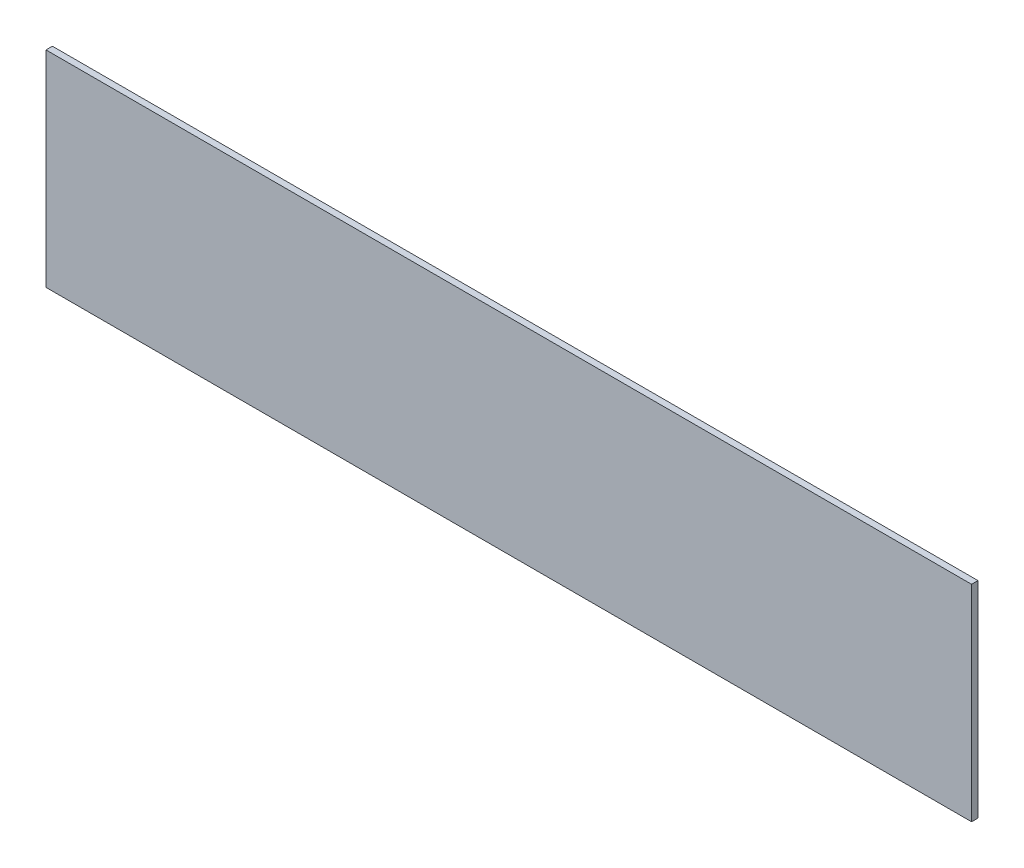
ISO-10303-21;
HEADER;
FILE_DESCRIPTION(('STEP AP214'),'2;1');
FILE_NAME('part.step','',(''),(''),'','','');
FILE_SCHEMA(('AUTOMOTIVE_DESIGN { 1 0 10303 214 1 1 1 1 }'));
ENDSEC;
DATA;
#1=APPLICATION_CONTEXT('core data for automotive mechanical design processes');
#2=APPLICATION_PROTOCOL_DEFINITION('international standard','automotive_design',2000,#1);
#3=PRODUCT_CONTEXT('',#1,'mechanical');
#4=PRODUCT('Part','Part','',(#3));
#5=PRODUCT_RELATED_PRODUCT_CATEGORY('part','',(#4));
#6=PRODUCT_DEFINITION_FORMATION('','',#4);
#7=PRODUCT_DEFINITION_CONTEXT('part definition',#1,'design');
#8=PRODUCT_DEFINITION('design','',#6,#7);
#9=PRODUCT_DEFINITION_SHAPE('','',#8);
#10=(LENGTH_UNIT() NAMED_UNIT(*) SI_UNIT(.MILLI.,.METRE.));
#11=(NAMED_UNIT(*) PLANE_ANGLE_UNIT() SI_UNIT($,.RADIAN.));
#12=(NAMED_UNIT(*) SI_UNIT($,.STERADIAN.) SOLID_ANGLE_UNIT());
#13=UNCERTAINTY_MEASURE_WITH_UNIT(LENGTH_MEASURE(1.E-05),#10,'distance_accuracy_value','');
#14=(GEOMETRIC_REPRESENTATION_CONTEXT(3) GLOBAL_UNCERTAINTY_ASSIGNED_CONTEXT((#13)) GLOBAL_UNIT_ASSIGNED_CONTEXT((#10,
#11,#12)) REPRESENTATION_CONTEXT('',''));
#15=CARTESIAN_POINT('',(0.,0.,0.));
#16=DIRECTION('',(0.,0.,1.));
#17=DIRECTION('',(1.,0.,0.));
#18=AXIS2_PLACEMENT_3D('',#15,#16,#17);
#19=CARTESIAN_POINT('',(0.,0.,1.5875));
#20=DIRECTION('',(-1.,0.,0.));
#21=DIRECTION('',(0.,0.,1.));
#22=AXIS2_PLACEMENT_3D('',#19,#20,#21);
#23=PLANE('',#22);
#24=DIRECTION('',(0.,1.,0.));
#25=VECTOR('',#24,1.);
#26=CARTESIAN_POINT('',(0.,0.,0.));
#27=LINE('',#26,#25);
#28=CARTESIAN_POINT('',(0.,-50.8,0.));
#29=VERTEX_POINT('',#28);
#30=CARTESIAN_POINT('',(0.,0.,0.));
#31=VERTEX_POINT('',#30);
#32=EDGE_CURVE('E99',#29,#31,#27,.T.);
#33=ORIENTED_EDGE('',*,*,#32,.T.);
#34=DIRECTION('',(0.,0.,-1.));
#35=VECTOR('',#34,1.);
#36=CARTESIAN_POINT('',(0.,0.,1.5875));
#37=LINE('',#36,#35);
#38=CARTESIAN_POINT('',(0.,0.,1.5875));
#39=VERTEX_POINT('',#38);
#40=EDGE_CURVE('E11',#39,#31,#37,.T.);
#41=ORIENTED_EDGE('',*,*,#40,.F.);
#42=DIRECTION('',(0.,1.,0.));
#43=VECTOR('',#42,1.);
#44=CARTESIAN_POINT('',(0.,0.,1.5875));
#45=LINE('',#44,#43);
#46=CARTESIAN_POINT('',(0.,-50.8,1.5875));
#47=VERTEX_POINT('',#46);
#48=EDGE_CURVE('E87',#47,#39,#45,.T.);
#49=ORIENTED_EDGE('',*,*,#48,.F.);
#50=DIRECTION('',(0.,0.,-1.));
#51=VECTOR('',#50,1.);
#52=CARTESIAN_POINT('',(0.,-50.8,1.5875));
#53=LINE('',#52,#51);
#54=EDGE_CURVE('E95',#47,#29,#53,.T.);
#55=ORIENTED_EDGE('',*,*,#54,.T.);
#56=EDGE_LOOP('',(#33,#41,#49,#55));
#57=FACE_BOUND('',#56,.T.);
#58=ADVANCED_FACE('F36',(#57),#23,.F.);
#59=CARTESIAN_POINT('',(0.,0.,1.5875));
#60=DIRECTION('',(0.,-1.,0.));
#61=DIRECTION('',(1.,0.,0.));
#62=AXIS2_PLACEMENT_3D('',#59,#60,#61);
#63=PLANE('',#62);
#64=DIRECTION('',(-1.,0.,0.));
#65=VECTOR('',#64,1.);
#66=CARTESIAN_POINT('',(0.,0.,0.));
#67=LINE('',#66,#65);
#68=CARTESIAN_POINT('',(-228.6,0.,0.));
#69=VERTEX_POINT('',#68);
#70=EDGE_CURVE('E91',#31,#69,#67,.T.);
#71=ORIENTED_EDGE('',*,*,#70,.T.);
#72=DIRECTION('',(0.,0.,-1.));
#73=VECTOR('',#72,1.);
#74=CARTESIAN_POINT('',(-228.6,0.,1.5875));
#75=LINE('',#74,#73);
#76=CARTESIAN_POINT('',(-228.6,0.,1.5875));
#77=VERTEX_POINT('',#76);
#78=EDGE_CURVE('E44',#77,#69,#75,.T.);
#79=ORIENTED_EDGE('',*,*,#78,.F.);
#80=DIRECTION('',(-1.,0.,0.));
#81=VECTOR('',#80,1.);
#82=CARTESIAN_POINT('',(0.,0.,1.5875));
#83=LINE('',#82,#81);
#84=EDGE_CURVE('E82',#39,#77,#83,.T.);
#85=ORIENTED_EDGE('',*,*,#84,.F.);
#86=ORIENTED_EDGE('',*,*,#40,.T.);
#87=EDGE_LOOP('',(#71,#79,#85,#86));
#88=FACE_BOUND('',#87,.T.);
#89=ADVANCED_FACE('F90',(#88),#63,.F.);
#90=CARTESIAN_POINT('',(-228.6,0.,1.5875));
#91=DIRECTION('',(1.,0.,0.));
#92=DIRECTION('',(0.,0.,-1.));
#93=AXIS2_PLACEMENT_3D('',#90,#91,#92);
#94=PLANE('',#93);
#95=DIRECTION('',(0.,-1.,0.));
#96=VECTOR('',#95,1.);
#97=CARTESIAN_POINT('',(-228.6,0.,0.));
#98=LINE('',#97,#96);
#99=CARTESIAN_POINT('',(-228.6,-50.8,0.));
#100=VERTEX_POINT('',#99);
#101=EDGE_CURVE('E69',#69,#100,#98,.T.);
#102=ORIENTED_EDGE('',*,*,#101,.T.);
#103=DIRECTION('',(0.,0.,-1.));
#104=VECTOR('',#103,1.);
#105=CARTESIAN_POINT('',(-228.6,-50.8,1.5875));
#106=LINE('',#105,#104);
#107=CARTESIAN_POINT('',(-228.6,-50.8,1.5875));
#108=VERTEX_POINT('',#107);
#109=EDGE_CURVE('E92',#108,#100,#106,.T.);
#110=ORIENTED_EDGE('',*,*,#109,.F.);
#111=DIRECTION('',(0.,-1.,0.));
#112=VECTOR('',#111,1.);
#113=CARTESIAN_POINT('',(-228.6,0.,1.5875));
#114=LINE('',#113,#112);
#115=EDGE_CURVE('E85',#77,#108,#114,.T.);
#116=ORIENTED_EDGE('',*,*,#115,.F.);
#117=ORIENTED_EDGE('',*,*,#78,.T.);
#118=EDGE_LOOP('',(#102,#110,#116,#117));
#119=FACE_BOUND('',#118,.T.);
#120=ADVANCED_FACE('F93',(#119),#94,.F.);
#121=CARTESIAN_POINT('',(0.,-50.8,1.5875));
#122=DIRECTION('',(0.,1.,0.));
#123=DIRECTION('',(-1.,0.,0.));
#124=AXIS2_PLACEMENT_3D('',#121,#122,#123);
#125=PLANE('',#124);
#126=DIRECTION('',(1.,0.,0.));
#127=VECTOR('',#126,1.);
#128=CARTESIAN_POINT('',(0.,-50.8,0.));
#129=LINE('',#128,#127);
#130=EDGE_CURVE('E75',#100,#29,#129,.T.);
#131=ORIENTED_EDGE('',*,*,#130,.T.);
#132=ORIENTED_EDGE('',*,*,#54,.F.);
#133=DIRECTION('',(1.,0.,0.));
#134=VECTOR('',#133,1.);
#135=CARTESIAN_POINT('',(0.,-50.8,1.5875));
#136=LINE('',#135,#134);
#137=EDGE_CURVE('E52',#108,#47,#136,.T.);
#138=ORIENTED_EDGE('',*,*,#137,.F.);
#139=ORIENTED_EDGE('',*,*,#109,.T.);
#140=EDGE_LOOP('',(#131,#132,#138,#139));
#141=FACE_BOUND('',#140,.T.);
#142=ADVANCED_FACE('F106',(#141),#125,.F.);
#143=CARTESIAN_POINT('',(0.,0.,1.5875));
#144=DIRECTION('',(0.,0.,-1.));
#145=DIRECTION('',(-1.,0.,0.));
#146=AXIS2_PLACEMENT_3D('',#143,#144,#145);
#147=PLANE('',#146);
#148=ORIENTED_EDGE('',*,*,#48,.T.);
#149=ORIENTED_EDGE('',*,*,#84,.T.);
#150=ORIENTED_EDGE('',*,*,#115,.T.);
#151=ORIENTED_EDGE('',*,*,#137,.T.);
#152=EDGE_LOOP('',(#148,#149,#150,#151));
#153=FACE_BOUND('',#152,.T.);
#154=ADVANCED_FACE('F83',(#153),#147,.F.);
#155=CARTESIAN_POINT('',(0.,0.,0.));
#156=DIRECTION('',(0.,0.,-1.));
#157=DIRECTION('',(-1.,0.,0.));
#158=AXIS2_PLACEMENT_3D('',#155,#156,#157);
#159=PLANE('',#158);
#160=ORIENTED_EDGE('',*,*,#32,.F.);
#161=ORIENTED_EDGE('',*,*,#130,.F.);
#162=ORIENTED_EDGE('',*,*,#101,.F.);
#163=ORIENTED_EDGE('',*,*,#70,.F.);
#164=EDGE_LOOP('',(#160,#161,#162,#163));
#165=FACE_BOUND('',#164,.T.);
#166=ADVANCED_FACE('F109',(#165),#159,.T.);
#167=CLOSED_SHELL('',(#58,#89,#120,#142,#154,#166));
#168=MANIFOLD_SOLID_BREP('B2',#167);
#169=ADVANCED_BREP_SHAPE_REPRESENTATION('',(#18,#168),#14);
#170=SHAPE_DEFINITION_REPRESENTATION(#9,#169);
ENDSEC;
END-ISO-10303-21;
